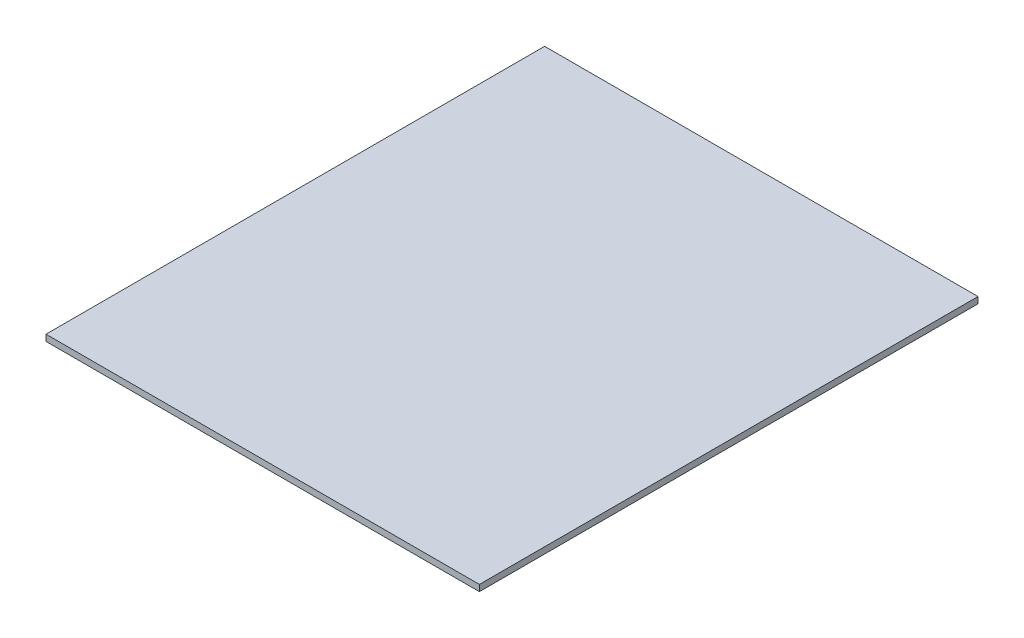
ISO-10303-21;
HEADER;
FILE_DESCRIPTION(('STEP AP214'),'2;1');
FILE_NAME('part.step','',(''),(''),'','','');
FILE_SCHEMA(('AUTOMOTIVE_DESIGN { 1 0 10303 214 1 1 1 1 }'));
ENDSEC;
DATA;
#1=APPLICATION_CONTEXT('core data for automotive mechanical design processes');
#2=APPLICATION_PROTOCOL_DEFINITION('international standard','automotive_design',2000,#1);
#3=PRODUCT_CONTEXT('',#1,'mechanical');
#4=PRODUCT('Part','Part','',(#3));
#5=PRODUCT_RELATED_PRODUCT_CATEGORY('part','',(#4));
#6=PRODUCT_DEFINITION_FORMATION('','',#4);
#7=PRODUCT_DEFINITION_CONTEXT('part definition',#1,'design');
#8=PRODUCT_DEFINITION('design','',#6,#7);
#9=PRODUCT_DEFINITION_SHAPE('','',#8);
#10=(LENGTH_UNIT() NAMED_UNIT(*) SI_UNIT(.MILLI.,.METRE.));
#11=(NAMED_UNIT(*) PLANE_ANGLE_UNIT() SI_UNIT($,.RADIAN.));
#12=(NAMED_UNIT(*) SI_UNIT($,.STERADIAN.) SOLID_ANGLE_UNIT());
#13=UNCERTAINTY_MEASURE_WITH_UNIT(LENGTH_MEASURE(1.E-05),#10,'distance_accuracy_value','');
#14=(GEOMETRIC_REPRESENTATION_CONTEXT(3) GLOBAL_UNCERTAINTY_ASSIGNED_CONTEXT((#13)) GLOBAL_UNIT_ASSIGNED_CONTEXT((#10,
#11,#12)) REPRESENTATION_CONTEXT('',''));
#15=CARTESIAN_POINT('',(0.,0.,0.));
#16=DIRECTION('',(0.,0.,1.));
#17=DIRECTION('',(1.,0.,0.));
#18=AXIS2_PLACEMENT_3D('',#15,#16,#17);
#19=CARTESIAN_POINT('',(0.,3.,0.));
#20=DIRECTION('',(1.,0.,0.));
#21=DIRECTION('',(0.,0.,-1.));
#22=AXIS2_PLACEMENT_3D('',#19,#20,#21);
#23=PLANE('',#22);
#24=DIRECTION('',(0.,0.,1.));
#25=VECTOR('',#24,1.);
#26=CARTESIAN_POINT('',(0.,0.,0.));
#27=LINE('',#26,#25);
#28=CARTESIAN_POINT('',(0.,0.,-237.));
#29=VERTEX_POINT('',#28);
#30=CARTESIAN_POINT('',(0.,0.,0.));
#31=VERTEX_POINT('',#30);
#32=EDGE_CURVE('E102',#29,#31,#27,.T.);
#33=ORIENTED_EDGE('',*,*,#32,.T.);
#34=DIRECTION('',(0.,-1.,0.));
#35=VECTOR('',#34,1.);
#36=CARTESIAN_POINT('',(0.,3.,0.));
#37=LINE('',#36,#35);
#38=CARTESIAN_POINT('',(0.,3.,0.));
#39=VERTEX_POINT('',#38);
#40=EDGE_CURVE('E11',#39,#31,#37,.T.);
#41=ORIENTED_EDGE('',*,*,#40,.F.);
#42=DIRECTION('',(0.,0.,1.));
#43=VECTOR('',#42,1.);
#44=CARTESIAN_POINT('',(0.,3.,0.));
#45=LINE('',#44,#43);
#46=CARTESIAN_POINT('',(0.,3.,-237.));
#47=VERTEX_POINT('',#46);
#48=EDGE_CURVE('E90',#47,#39,#45,.T.);
#49=ORIENTED_EDGE('',*,*,#48,.F.);
#50=DIRECTION('',(0.,-1.,0.));
#51=VECTOR('',#50,1.);
#52=CARTESIAN_POINT('',(0.,3.,-237.));
#53=LINE('',#52,#51);
#54=EDGE_CURVE('E98',#47,#29,#53,.T.);
#55=ORIENTED_EDGE('',*,*,#54,.T.);
#56=EDGE_LOOP('',(#33,#41,#49,#55));
#57=FACE_BOUND('',#56,.T.);
#58=ADVANCED_FACE('F39',(#57),#23,.F.);
#59=CARTESIAN_POINT('',(0.,3.,0.));
#60=DIRECTION('',(0.,0.,-1.));
#61=DIRECTION('',(-1.,0.,0.));
#62=AXIS2_PLACEMENT_3D('',#59,#60,#61);
#63=PLANE('',#62);
#64=DIRECTION('',(1.,0.,0.));
#65=VECTOR('',#64,1.);
#66=CARTESIAN_POINT('',(0.,0.,0.));
#67=LINE('',#66,#65);
#68=CARTESIAN_POINT('',(206.,0.,0.));
#69=VERTEX_POINT('',#68);
#70=EDGE_CURVE('E94',#31,#69,#67,.T.);
#71=ORIENTED_EDGE('',*,*,#70,.T.);
#72=DIRECTION('',(0.,-1.,0.));
#73=VECTOR('',#72,1.);
#74=CARTESIAN_POINT('',(206.,3.,0.));
#75=LINE('',#74,#73);
#76=CARTESIAN_POINT('',(206.,3.,0.));
#77=VERTEX_POINT('',#76);
#78=EDGE_CURVE('E47',#77,#69,#75,.T.);
#79=ORIENTED_EDGE('',*,*,#78,.F.);
#80=DIRECTION('',(1.,0.,0.));
#81=VECTOR('',#80,1.);
#82=CARTESIAN_POINT('',(0.,3.,0.));
#83=LINE('',#82,#81);
#84=EDGE_CURVE('E85',#39,#77,#83,.T.);
#85=ORIENTED_EDGE('',*,*,#84,.F.);
#86=ORIENTED_EDGE('',*,*,#40,.T.);
#87=EDGE_LOOP('',(#71,#79,#85,#86));
#88=FACE_BOUND('',#87,.T.);
#89=ADVANCED_FACE('F93',(#88),#63,.F.);
#90=CARTESIAN_POINT('',(206.,3.,0.));
#91=DIRECTION('',(-1.,0.,0.));
#92=DIRECTION('',(0.,0.,1.));
#93=AXIS2_PLACEMENT_3D('',#90,#91,#92);
#94=PLANE('',#93);
#95=DIRECTION('',(0.,0.,-1.));
#96=VECTOR('',#95,1.);
#97=CARTESIAN_POINT('',(206.,0.,0.));
#98=LINE('',#97,#96);
#99=CARTESIAN_POINT('',(206.,0.,-237.));
#100=VERTEX_POINT('',#99);
#101=EDGE_CURVE('E72',#69,#100,#98,.T.);
#102=ORIENTED_EDGE('',*,*,#101,.T.);
#103=DIRECTION('',(0.,-1.,0.));
#104=VECTOR('',#103,1.);
#105=CARTESIAN_POINT('',(206.,3.,-237.));
#106=LINE('',#105,#104);
#107=CARTESIAN_POINT('',(206.,3.,-237.));
#108=VERTEX_POINT('',#107);
#109=EDGE_CURVE('E95',#108,#100,#106,.T.);
#110=ORIENTED_EDGE('',*,*,#109,.F.);
#111=DIRECTION('',(0.,0.,-1.));
#112=VECTOR('',#111,1.);
#113=CARTESIAN_POINT('',(206.,3.,0.));
#114=LINE('',#113,#112);
#115=EDGE_CURVE('E88',#77,#108,#114,.T.);
#116=ORIENTED_EDGE('',*,*,#115,.F.);
#117=ORIENTED_EDGE('',*,*,#78,.T.);
#118=EDGE_LOOP('',(#102,#110,#116,#117));
#119=FACE_BOUND('',#118,.T.);
#120=ADVANCED_FACE('F96',(#119),#94,.F.);
#121=CARTESIAN_POINT('',(0.,3.,-237.));
#122=DIRECTION('',(0.,0.,1.));
#123=DIRECTION('',(1.,0.,0.));
#124=AXIS2_PLACEMENT_3D('',#121,#122,#123);
#125=PLANE('',#124);
#126=DIRECTION('',(-1.,0.,0.));
#127=VECTOR('',#126,1.);
#128=CARTESIAN_POINT('',(0.,0.,-237.));
#129=LINE('',#128,#127);
#130=EDGE_CURVE('E78',#100,#29,#129,.T.);
#131=ORIENTED_EDGE('',*,*,#130,.T.);
#132=ORIENTED_EDGE('',*,*,#54,.F.);
#133=DIRECTION('',(-1.,0.,0.));
#134=VECTOR('',#133,1.);
#135=CARTESIAN_POINT('',(0.,3.,-237.));
#136=LINE('',#135,#134);
#137=EDGE_CURVE('E55',#108,#47,#136,.T.);
#138=ORIENTED_EDGE('',*,*,#137,.F.);
#139=ORIENTED_EDGE('',*,*,#109,.T.);
#140=EDGE_LOOP('',(#131,#132,#138,#139));
#141=FACE_BOUND('',#140,.T.);
#142=ADVANCED_FACE('F109',(#141),#125,.F.);
#143=CARTESIAN_POINT('',(0.,3.,0.));
#144=DIRECTION('',(0.,-1.,0.));
#145=DIRECTION('',(0.,0.,-1.));
#146=AXIS2_PLACEMENT_3D('',#143,#144,#145);
#147=PLANE('',#146);
#148=ORIENTED_EDGE('',*,*,#48,.T.);
#149=ORIENTED_EDGE('',*,*,#84,.T.);
#150=ORIENTED_EDGE('',*,*,#115,.T.);
#151=ORIENTED_EDGE('',*,*,#137,.T.);
#152=EDGE_LOOP('',(#148,#149,#150,#151));
#153=FACE_BOUND('',#152,.T.);
#154=ADVANCED_FACE('F86',(#153),#147,.F.);
#155=CARTESIAN_POINT('',(0.,0.,0.));
#156=DIRECTION('',(0.,-1.,0.));
#157=DIRECTION('',(0.,0.,-1.));
#158=AXIS2_PLACEMENT_3D('',#155,#156,#157);
#159=PLANE('',#158);
#160=ORIENTED_EDGE('',*,*,#32,.F.);
#161=ORIENTED_EDGE('',*,*,#130,.F.);
#162=ORIENTED_EDGE('',*,*,#101,.F.);
#163=ORIENTED_EDGE('',*,*,#70,.F.);
#164=EDGE_LOOP('',(#160,#161,#162,#163));
#165=FACE_BOUND('',#164,.T.);
#166=ADVANCED_FACE('F112',(#165),#159,.T.);
#167=CLOSED_SHELL('',(#58,#89,#120,#142,#154,#166));
#168=MANIFOLD_SOLID_BREP('B2',#167);
#169=ADVANCED_BREP_SHAPE_REPRESENTATION('',(#18,#168),#14);
#170=SHAPE_DEFINITION_REPRESENTATION(#9,#169);
ENDSEC;
END-ISO-10303-21;
